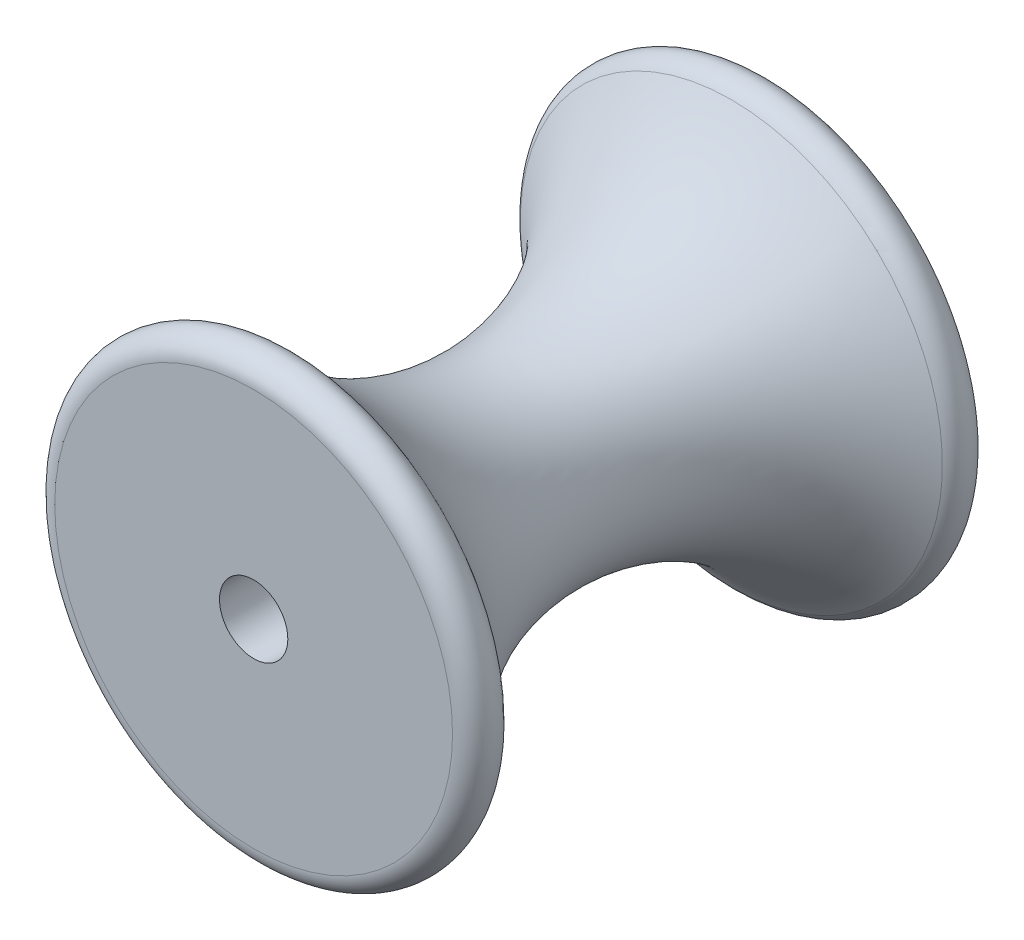
ISO-10303-21;
HEADER;
FILE_DESCRIPTION(('STEP AP214'),'2;1');
FILE_NAME('part.step','',(''),(''),'','','');
FILE_SCHEMA(('AUTOMOTIVE_DESIGN { 1 0 10303 214 1 1 1 1 }'));
ENDSEC;
DATA;
#1=APPLICATION_CONTEXT('core data for automotive mechanical design processes');
#2=APPLICATION_PROTOCOL_DEFINITION('international standard','automotive_design',2000,#1);
#3=PRODUCT_CONTEXT('',#1,'mechanical');
#4=PRODUCT('Part','Part','',(#3));
#5=PRODUCT_RELATED_PRODUCT_CATEGORY('part','',(#4));
#6=PRODUCT_DEFINITION_FORMATION('','',#4);
#7=PRODUCT_DEFINITION_CONTEXT('part definition',#1,'design');
#8=PRODUCT_DEFINITION('design','',#6,#7);
#9=PRODUCT_DEFINITION_SHAPE('','',#8);
#10=(LENGTH_UNIT() NAMED_UNIT(*) SI_UNIT(.MILLI.,.METRE.));
#11=(NAMED_UNIT(*) PLANE_ANGLE_UNIT() SI_UNIT($,.RADIAN.));
#12=(NAMED_UNIT(*) SI_UNIT($,.STERADIAN.) SOLID_ANGLE_UNIT());
#13=UNCERTAINTY_MEASURE_WITH_UNIT(LENGTH_MEASURE(1.E-05),#10,'distance_accuracy_value','');
#14=(GEOMETRIC_REPRESENTATION_CONTEXT(3) GLOBAL_UNCERTAINTY_ASSIGNED_CONTEXT((#13)) GLOBAL_UNIT_ASSIGNED_CONTEXT((#10,
#11,#12)) REPRESENTATION_CONTEXT('',''));
#15=CARTESIAN_POINT('',(0.,0.,0.));
#16=DIRECTION('',(0.,0.,1.));
#17=DIRECTION('',(1.,0.,0.));
#18=AXIS2_PLACEMENT_3D('',#15,#16,#17);
#19=CARTESIAN_POINT('',(0.,0.,-12.1));
#20=DIRECTION('',(0.,0.,-1.));
#21=DIRECTION('',(0.,1.,0.));
#22=AXIS2_PLACEMENT_3D('',#19,#20,#21);
#23=PLANE('',#22);
#24=CARTESIAN_POINT('',(0.,0.,-12.1));
#25=DIRECTION('',(0.,0.,-1.));
#26=DIRECTION('',(0.,1.,0.));
#27=AXIS2_PLACEMENT_3D('',#24,#25,#26);
#28=CIRCLE('',#27,9.31625091508059);
#29=CARTESIAN_POINT('',(0.,9.31625091508059,-12.1));
#30=VERTEX_POINT('',#29);
#31=EDGE_CURVE('E10',#30,#30,#28,.T.);
#32=ORIENTED_EDGE('',*,*,#31,.T.);
#33=EDGE_LOOP('',(#32));
#34=FACE_BOUND('',#33,.T.);
#35=CARTESIAN_POINT('',(0.,0.,-12.1));
#36=DIRECTION('',(0.,0.,-1.));
#37=DIRECTION('',(0.,1.,0.));
#38=AXIS2_PLACEMENT_3D('',#35,#36,#37);
#39=CIRCLE('',#38,1.60000000000001);
#40=CARTESIAN_POINT('',(0.,1.60000000000001,-12.1));
#41=VERTEX_POINT('',#40);
#42=EDGE_CURVE('E62',#41,#41,#39,.T.);
#43=ORIENTED_EDGE('',*,*,#42,.F.);
#44=EDGE_LOOP('',(#43));
#45=FACE_BOUND('',#44,.T.);
#46=ADVANCED_FACE('F39',(#34,#45),#23,.T.);
#47=CARTESIAN_POINT('',(0.,0.,0.));
#48=DIRECTION('',(0.,0.,-1.));
#49=DIRECTION('',(0.,1.,0.));
#50=AXIS2_PLACEMENT_3D('',#47,#48,#49);
#51=TOROIDAL_SURFACE('',#50,17.,12.5);
#52=CARTESIAN_POINT('',(0.,0.,10.2777777777778));
#53=DIRECTION('',(0.,0.,-1.));
#54=DIRECTION('',(0.,1.,0.));
#55=AXIS2_PLACEMENT_3D('',#52,#53,#54);
#56=CIRCLE('',#55,9.88541751396351);
#57=CARTESIAN_POINT('',(0.,9.8854175139635,10.2777777777778));
#58=VERTEX_POINT('',#57);
#59=EDGE_CURVE('E50',#58,#58,#56,.T.);
#60=ORIENTED_EDGE('',*,*,#59,.T.);
#61=EDGE_LOOP('',(#60));
#62=FACE_BOUND('',#61,.T.);
#63=CARTESIAN_POINT('',(0.,0.,-10.2777777777778));
#64=DIRECTION('',(0.,0.,1.));
#65=DIRECTION('',(0.,-1.,0.));
#66=AXIS2_PLACEMENT_3D('',#63,#64,#65);
#67=CIRCLE('',#66,9.88541751396351);
#68=CARTESIAN_POINT('',(0.,-9.88541751396351,-10.2777777777778));
#69=VERTEX_POINT('',#68);
#70=EDGE_CURVE('E54',#69,#69,#67,.T.);
#71=ORIENTED_EDGE('',*,*,#70,.T.);
#72=EDGE_LOOP('',(#71));
#73=FACE_BOUND('',#72,.T.);
#74=ADVANCED_FACE('F69',(#62,#73),#51,.F.);
#75=CARTESIAN_POINT('',(0.,0.,12.1));
#76=DIRECTION('',(0.,0.,-1.));
#77=DIRECTION('',(0.,1.,0.));
#78=AXIS2_PLACEMENT_3D('',#75,#76,#77);
#79=PLANE('',#78);
#80=CARTESIAN_POINT('',(0.,0.,12.1));
#81=DIRECTION('',(0.,0.,-1.));
#82=DIRECTION('',(0.,1.,0.));
#83=AXIS2_PLACEMENT_3D('',#80,#81,#82);
#84=CIRCLE('',#83,9.31625091508059);
#85=CARTESIAN_POINT('',(0.,9.31625091508059,12.1));
#86=VERTEX_POINT('',#85);
#87=EDGE_CURVE('E46',#86,#86,#84,.F.);
#88=ORIENTED_EDGE('',*,*,#87,.T.);
#89=EDGE_LOOP('',(#88));
#90=FACE_BOUND('',#89,.T.);
#91=CARTESIAN_POINT('',(0.,0.,12.1));
#92=DIRECTION('',(0.,0.,-1.));
#93=DIRECTION('',(0.,1.,0.));
#94=AXIS2_PLACEMENT_3D('',#91,#92,#93);
#95=CIRCLE('',#94,1.60000000000001);
#96=CARTESIAN_POINT('',(0.,1.6,12.1));
#97=VERTEX_POINT('',#96);
#98=EDGE_CURVE('E59',#97,#97,#95,.T.);
#99=ORIENTED_EDGE('',*,*,#98,.T.);
#100=EDGE_LOOP('',(#99));
#101=FACE_BOUND('',#100,.T.);
#102=ADVANCED_FACE('F75',(#90,#101),#79,.F.);
#103=CARTESIAN_POINT('',(0.,0.,-12.5));
#104=DIRECTION('',(0.,0.,-1.));
#105=DIRECTION('',(0.,1.,0.));
#106=AXIS2_PLACEMENT_3D('',#103,#104,#105);
#107=CYLINDRICAL_SURFACE('',#106,1.60000000000001);
#108=ORIENTED_EDGE('',*,*,#98,.F.);
#109=EDGE_LOOP('',(#108));
#110=FACE_BOUND('',#109,.T.);
#111=ORIENTED_EDGE('',*,*,#42,.T.);
#112=EDGE_LOOP('',(#111));
#113=FACE_BOUND('',#112,.T.);
#114=ADVANCED_FACE('F66',(#110,#113),#107,.F.);
#115=CARTESIAN_POINT('',(0.,0.,11.1));
#116=DIRECTION('',(0.,0.,1.));
#117=DIRECTION('',(0.,-1.,0.));
#118=AXIS2_PLACEMENT_3D('',#115,#116,#117);
#119=TOROIDAL_SURFACE('',#118,9.31625091508059,1.);
#120=ORIENTED_EDGE('',*,*,#87,.F.);
#121=EDGE_LOOP('',(#120));
#122=FACE_BOUND('',#121,.T.);
#123=ORIENTED_EDGE('',*,*,#59,.F.);
#124=EDGE_LOOP('',(#123));
#125=FACE_BOUND('',#124,.T.);
#126=ADVANCED_FACE('F79',(#122,#125),#119,.T.);
#127=CARTESIAN_POINT('',(0.,0.,-11.1));
#128=DIRECTION('',(0.,0.,1.));
#129=DIRECTION('',(0.,-1.,0.));
#130=AXIS2_PLACEMENT_3D('',#127,#128,#129);
#131=TOROIDAL_SURFACE('',#130,9.31625091508059,1.);
#132=ORIENTED_EDGE('',*,*,#70,.F.);
#133=EDGE_LOOP('',(#132));
#134=FACE_BOUND('',#133,.T.);
#135=ORIENTED_EDGE('',*,*,#31,.F.);
#136=EDGE_LOOP('',(#135));
#137=FACE_BOUND('',#136,.T.);
#138=ADVANCED_FACE('F41',(#134,#137),#131,.T.);
#139=CLOSED_SHELL('',(#46,#74,#102,#114,#126,#138));
#140=MANIFOLD_SOLID_BREP('B2',#139);
#141=ADVANCED_BREP_SHAPE_REPRESENTATION('',(#18,#140),#14);
#142=SHAPE_DEFINITION_REPRESENTATION(#9,#141);
ENDSEC;
END-ISO-10303-21;
